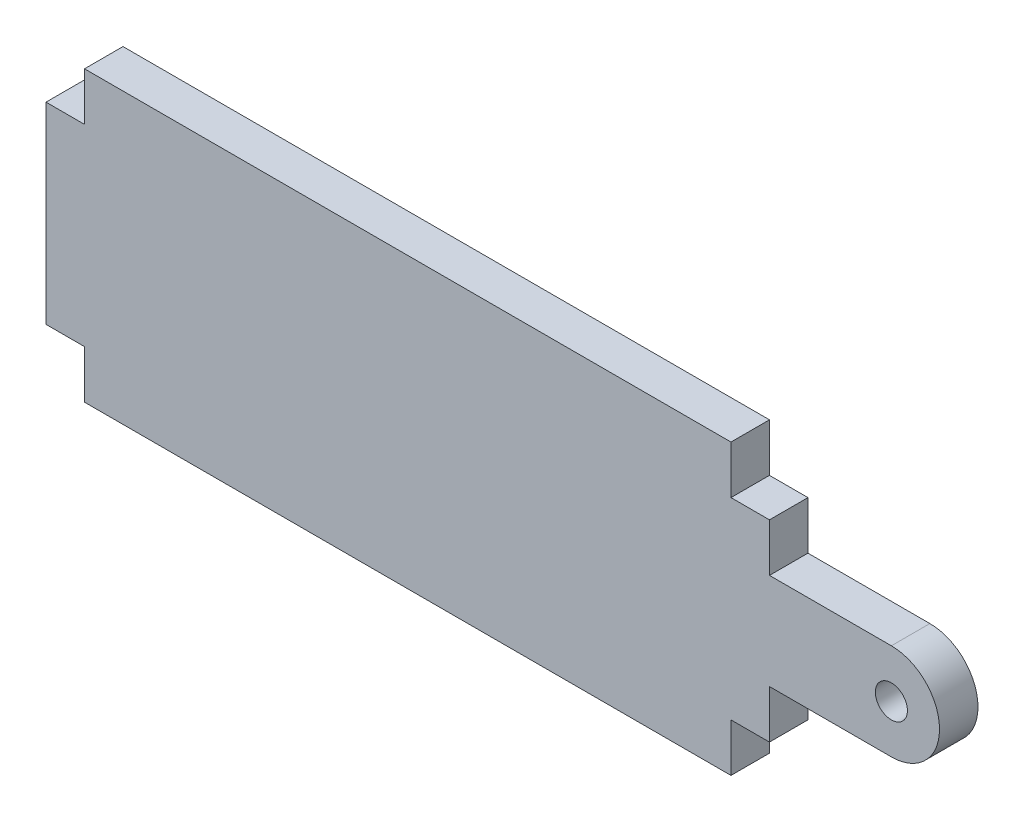
ISO-10303-21;
HEADER;
FILE_DESCRIPTION(('STEP AP214'),'2;1');
FILE_NAME('part.step','',(''),(''),'','','');
FILE_SCHEMA(('AUTOMOTIVE_DESIGN { 1 0 10303 214 1 1 1 1 }'));
ENDSEC;
DATA;
#1=APPLICATION_CONTEXT('core data for automotive mechanical design processes');
#2=APPLICATION_PROTOCOL_DEFINITION('international standard','automotive_design',2000,#1);
#3=PRODUCT_CONTEXT('',#1,'mechanical');
#4=PRODUCT('Part','Part','',(#3));
#5=PRODUCT_RELATED_PRODUCT_CATEGORY('part','',(#4));
#6=PRODUCT_DEFINITION_FORMATION('','',#4);
#7=PRODUCT_DEFINITION_CONTEXT('part definition',#1,'design');
#8=PRODUCT_DEFINITION('design','',#6,#7);
#9=PRODUCT_DEFINITION_SHAPE('','',#8);
#10=(LENGTH_UNIT() NAMED_UNIT(*) SI_UNIT(.MILLI.,.METRE.));
#11=(NAMED_UNIT(*) PLANE_ANGLE_UNIT() SI_UNIT($,.RADIAN.));
#12=(NAMED_UNIT(*) SI_UNIT($,.STERADIAN.) SOLID_ANGLE_UNIT());
#13=UNCERTAINTY_MEASURE_WITH_UNIT(LENGTH_MEASURE(1.E-05),#10,'distance_accuracy_value','');
#14=(GEOMETRIC_REPRESENTATION_CONTEXT(3) GLOBAL_UNCERTAINTY_ASSIGNED_CONTEXT((#13)) GLOBAL_UNIT_ASSIGNED_CONTEXT((#10,
#11,#12)) REPRESENTATION_CONTEXT('',''));
#15=CARTESIAN_POINT('',(0.,0.,0.));
#16=DIRECTION('',(0.,0.,1.));
#17=DIRECTION('',(1.,0.,0.));
#18=AXIS2_PLACEMENT_3D('',#15,#16,#17);
#19=CARTESIAN_POINT('',(0.,-3.00000000000007,2.4));
#20=DIRECTION('',(0.,1.,0.));
#21=DIRECTION('',(-1.,0.,0.));
#22=AXIS2_PLACEMENT_3D('',#19,#20,#21);
#23=PLANE('',#22);
#24=DIRECTION('',(1.,0.,0.));
#25=VECTOR('',#24,1.);
#26=CARTESIAN_POINT('',(0.,-3.00000000000007,0.));
#27=LINE('',#26,#25);
#28=CARTESIAN_POINT('',(22.55,-3.00000000000001,0.));
#29=VERTEX_POINT('',#28);
#30=CARTESIAN_POINT('',(30.15,-2.99999999999999,0.));
#31=VERTEX_POINT('',#30);
#32=EDGE_CURVE('E252',#29,#31,#27,.T.);
#33=ORIENTED_EDGE('',*,*,#32,.T.);
#34=DIRECTION('',(0.,0.,-1.));
#35=VECTOR('',#34,1.);
#36=CARTESIAN_POINT('',(30.15,-2.99999999999999,2.4));
#37=LINE('',#36,#35);
#38=CARTESIAN_POINT('',(30.15,-2.99999999999999,2.4));
#39=VERTEX_POINT('',#38);
#40=EDGE_CURVE('E11',#39,#31,#37,.T.);
#41=ORIENTED_EDGE('',*,*,#40,.F.);
#42=DIRECTION('',(1.,0.,0.));
#43=VECTOR('',#42,1.);
#44=CARTESIAN_POINT('',(0.,-3.00000000000007,2.4));
#45=LINE('',#44,#43);
#46=CARTESIAN_POINT('',(22.55,-3.00000000000001,2.4));
#47=VERTEX_POINT('',#46);
#48=EDGE_CURVE('E200',#47,#39,#45,.T.);
#49=ORIENTED_EDGE('',*,*,#48,.F.);
#50=DIRECTION('',(0.,0.,-1.));
#51=VECTOR('',#50,1.);
#52=CARTESIAN_POINT('',(22.55,-3.00000000000001,2.4));
#53=LINE('',#52,#51);
#54=EDGE_CURVE('E52',#47,#29,#53,.T.);
#55=ORIENTED_EDGE('',*,*,#54,.T.);
#56=EDGE_LOOP('',(#33,#41,#49,#55));
#57=FACE_BOUND('',#56,.T.);
#58=ADVANCED_FACE('F36',(#57),#23,.F.);
#59=CARTESIAN_POINT('',(30.15,0.,2.4));
#60=DIRECTION('',(0.,0.,-1.));
#61=DIRECTION('',(-1.,0.,0.));
#62=AXIS2_PLACEMENT_3D('',#59,#60,#61);
#63=CYLINDRICAL_SURFACE('',#62,2.99999999999994);
#64=CARTESIAN_POINT('',(30.15,0.,0.));
#65=DIRECTION('',(0.,0.,1.));
#66=DIRECTION('',(1.,0.,0.));
#67=AXIS2_PLACEMENT_3D('',#64,#65,#66);
#68=CIRCLE('',#67,2.99999999999994);
#69=CARTESIAN_POINT('',(30.15,2.99999999999999,0.));
#70=VERTEX_POINT('',#69);
#71=EDGE_CURVE('E249',#31,#70,#68,.T.);
#72=ORIENTED_EDGE('',*,*,#71,.T.);
#73=DIRECTION('',(0.,0.,-1.));
#74=VECTOR('',#73,1.);
#75=CARTESIAN_POINT('',(30.15,2.99999999999999,2.4));
#76=LINE('',#75,#74);
#77=CARTESIAN_POINT('',(30.15,2.99999999999999,2.4));
#78=VERTEX_POINT('',#77);
#79=EDGE_CURVE('E44',#78,#70,#76,.T.);
#80=ORIENTED_EDGE('',*,*,#79,.F.);
#81=CARTESIAN_POINT('',(30.15,0.,2.4));
#82=DIRECTION('',(0.,0.,1.));
#83=DIRECTION('',(1.,0.,0.));
#84=AXIS2_PLACEMENT_3D('',#81,#82,#83);
#85=CIRCLE('',#84,2.99999999999994);
#86=EDGE_CURVE('E115',#39,#78,#85,.T.);
#87=ORIENTED_EDGE('',*,*,#86,.F.);
#88=ORIENTED_EDGE('',*,*,#40,.T.);
#89=EDGE_LOOP('',(#72,#80,#87,#88));
#90=FACE_BOUND('',#89,.T.);
#91=ADVANCED_FACE('F250',(#90),#63,.T.);
#92=CARTESIAN_POINT('',(0.,2.99999999999999,2.4));
#93=DIRECTION('',(0.,1.,0.));
#94=DIRECTION('',(0.,0.,1.));
#95=AXIS2_PLACEMENT_3D('',#92,#93,#94);
#96=PLANE('',#95);
#97=DIRECTION('',(1.,0.,0.));
#98=VECTOR('',#97,1.);
#99=CARTESIAN_POINT('',(0.,2.99999999999999,0.));
#100=LINE('',#99,#98);
#101=CARTESIAN_POINT('',(22.55,2.99999999999999,0.));
#102=VERTEX_POINT('',#101);
#103=EDGE_CURVE('E246',#102,#70,#100,.T.);
#104=ORIENTED_EDGE('',*,*,#103,.F.);
#105=DIRECTION('',(0.,0.,-1.));
#106=VECTOR('',#105,1.);
#107=CARTESIAN_POINT('',(22.55,2.99999999999999,2.4));
#108=LINE('',#107,#106);
#109=CARTESIAN_POINT('',(22.55,2.99999999999999,2.4));
#110=VERTEX_POINT('',#109);
#111=EDGE_CURVE('E240',#110,#102,#108,.T.);
#112=ORIENTED_EDGE('',*,*,#111,.F.);
#113=DIRECTION('',(1.,0.,0.));
#114=VECTOR('',#113,1.);
#115=CARTESIAN_POINT('',(0.,2.99999999999999,2.4));
#116=LINE('',#115,#114);
#117=EDGE_CURVE('E194',#110,#78,#116,.T.);
#118=ORIENTED_EDGE('',*,*,#117,.T.);
#119=ORIENTED_EDGE('',*,*,#79,.T.);
#120=EDGE_LOOP('',(#104,#112,#118,#119));
#121=FACE_BOUND('',#120,.T.);
#122=ADVANCED_FACE('F244',(#121),#96,.T.);
#123=CARTESIAN_POINT('',(22.55,0.,2.4));
#124=DIRECTION('',(1.,0.,0.));
#125=DIRECTION('',(0.,1.,0.));
#126=AXIS2_PLACEMENT_3D('',#123,#124,#125);
#127=PLANE('',#126);
#128=DIRECTION('',(0.,-1.,0.));
#129=VECTOR('',#128,1.);
#130=CARTESIAN_POINT('',(22.55,0.,0.));
#131=LINE('',#130,#129);
#132=CARTESIAN_POINT('',(22.55,6.00000000000001,0.));
#133=VERTEX_POINT('',#132);
#134=EDGE_CURVE('E211',#133,#102,#131,.T.);
#135=ORIENTED_EDGE('',*,*,#134,.F.);
#136=DIRECTION('',(0.,0.,-1.));
#137=VECTOR('',#136,1.);
#138=CARTESIAN_POINT('',(22.55,6.00000000000001,2.4));
#139=LINE('',#138,#137);
#140=CARTESIAN_POINT('',(22.55,6.00000000000001,2.4));
#141=VERTEX_POINT('',#140);
#142=EDGE_CURVE('E238',#141,#133,#139,.T.);
#143=ORIENTED_EDGE('',*,*,#142,.F.);
#144=DIRECTION('',(0.,-1.,0.));
#145=VECTOR('',#144,1.);
#146=CARTESIAN_POINT('',(22.55,0.,2.4));
#147=LINE('',#146,#145);
#148=EDGE_CURVE('E190',#141,#110,#147,.T.);
#149=ORIENTED_EDGE('',*,*,#148,.T.);
#150=ORIENTED_EDGE('',*,*,#111,.T.);
#151=EDGE_LOOP('',(#135,#143,#149,#150));
#152=FACE_BOUND('',#151,.T.);
#153=ADVANCED_FACE('F319',(#152),#127,.T.);
#154=CARTESIAN_POINT('',(0.,6.,2.4));
#155=DIRECTION('',(0.,1.,0.));
#156=DIRECTION('',(-1.,0.,0.));
#157=AXIS2_PLACEMENT_3D('',#154,#155,#156);
#158=PLANE('',#157);
#159=DIRECTION('',(1.,0.,0.));
#160=VECTOR('',#159,1.);
#161=CARTESIAN_POINT('',(0.,6.,0.));
#162=LINE('',#161,#160);
#163=CARTESIAN_POINT('',(20.15,6.00000000000001,0.));
#164=VERTEX_POINT('',#163);
#165=EDGE_CURVE('E258',#164,#133,#162,.T.);
#166=ORIENTED_EDGE('',*,*,#165,.F.);
#167=DIRECTION('',(0.,0.,-1.));
#168=VECTOR('',#167,1.);
#169=CARTESIAN_POINT('',(20.15,6.00000000000001,2.4));
#170=LINE('',#169,#168);
#171=CARTESIAN_POINT('',(20.15,6.00000000000001,2.4));
#172=VERTEX_POINT('',#171);
#173=EDGE_CURVE('E236',#172,#164,#170,.T.);
#174=ORIENTED_EDGE('',*,*,#173,.F.);
#175=DIRECTION('',(1.,0.,0.));
#176=VECTOR('',#175,1.);
#177=CARTESIAN_POINT('',(0.,6.,2.4));
#178=LINE('',#177,#176);
#179=EDGE_CURVE('E185',#172,#141,#178,.T.);
#180=ORIENTED_EDGE('',*,*,#179,.T.);
#181=ORIENTED_EDGE('',*,*,#142,.T.);
#182=EDGE_LOOP('',(#166,#174,#180,#181));
#183=FACE_BOUND('',#182,.T.);
#184=ADVANCED_FACE('F316',(#183),#158,.T.);
#185=CARTESIAN_POINT('',(20.15,0.,2.4));
#186=DIRECTION('',(1.,0.,0.));
#187=DIRECTION('',(0.,1.,0.));
#188=AXIS2_PLACEMENT_3D('',#185,#186,#187);
#189=PLANE('',#188);
#190=DIRECTION('',(0.,-1.,0.));
#191=VECTOR('',#190,1.);
#192=CARTESIAN_POINT('',(20.15,0.,0.));
#193=LINE('',#192,#191);
#194=CARTESIAN_POINT('',(20.15,8.99999999999999,0.));
#195=VERTEX_POINT('',#194);
#196=EDGE_CURVE('E262',#195,#164,#193,.T.);
#197=ORIENTED_EDGE('',*,*,#196,.F.);
#198=DIRECTION('',(0.,0.,-1.));
#199=VECTOR('',#198,1.);
#200=CARTESIAN_POINT('',(20.15,8.99999999999999,2.4));
#201=LINE('',#200,#199);
#202=CARTESIAN_POINT('',(20.15,8.99999999999999,2.4));
#203=VERTEX_POINT('',#202);
#204=EDGE_CURVE('E234',#203,#195,#201,.T.);
#205=ORIENTED_EDGE('',*,*,#204,.F.);
#206=DIRECTION('',(0.,-1.,0.));
#207=VECTOR('',#206,1.);
#208=CARTESIAN_POINT('',(20.15,0.,2.4));
#209=LINE('',#208,#207);
#210=EDGE_CURVE('E178',#203,#172,#209,.T.);
#211=ORIENTED_EDGE('',*,*,#210,.T.);
#212=ORIENTED_EDGE('',*,*,#173,.T.);
#213=EDGE_LOOP('',(#197,#205,#211,#212));
#214=FACE_BOUND('',#213,.T.);
#215=ADVANCED_FACE('F314',(#214),#189,.T.);
#216=CARTESIAN_POINT('',(0.,8.99999999999999,2.4));
#217=DIRECTION('',(0.,-1.,0.));
#218=DIRECTION('',(0.,0.,-1.));
#219=AXIS2_PLACEMENT_3D('',#216,#217,#218);
#220=PLANE('',#219);
#221=DIRECTION('',(-1.,0.,0.));
#222=VECTOR('',#221,1.);
#223=CARTESIAN_POINT('',(0.,8.99999999999999,0.));
#224=LINE('',#223,#222);
#225=CARTESIAN_POINT('',(-20.15,8.99999999999999,0.));
#226=VERTEX_POINT('',#225);
#227=EDGE_CURVE('E265',#195,#226,#224,.T.);
#228=ORIENTED_EDGE('',*,*,#227,.T.);
#229=DIRECTION('',(0.,0.,-1.));
#230=VECTOR('',#229,1.);
#231=CARTESIAN_POINT('',(-20.15,8.99999999999999,2.4));
#232=LINE('',#231,#230);
#233=CARTESIAN_POINT('',(-20.15,8.99999999999999,2.4));
#234=VERTEX_POINT('',#233);
#235=EDGE_CURVE('E231',#234,#226,#232,.T.);
#236=ORIENTED_EDGE('',*,*,#235,.F.);
#237=DIRECTION('',(-1.,0.,0.));
#238=VECTOR('',#237,1.);
#239=CARTESIAN_POINT('',(0.,8.99999999999999,2.4));
#240=LINE('',#239,#238);
#241=EDGE_CURVE('E184',#203,#234,#240,.T.);
#242=ORIENTED_EDGE('',*,*,#241,.F.);
#243=ORIENTED_EDGE('',*,*,#204,.T.);
#244=EDGE_LOOP('',(#228,#236,#242,#243));
#245=FACE_BOUND('',#244,.T.);
#246=ADVANCED_FACE('F312',(#245),#220,.F.);
#247=CARTESIAN_POINT('',(-20.15,0.,2.4));
#248=DIRECTION('',(1.,0.,0.));
#249=DIRECTION('',(0.,1.,0.));
#250=AXIS2_PLACEMENT_3D('',#247,#248,#249);
#251=PLANE('',#250);
#252=DIRECTION('',(0.,-1.,0.));
#253=VECTOR('',#252,1.);
#254=CARTESIAN_POINT('',(-20.15,0.,0.));
#255=LINE('',#254,#253);
#256=CARTESIAN_POINT('',(-20.15,6.,0.));
#257=VERTEX_POINT('',#256);
#258=EDGE_CURVE('E267',#226,#257,#255,.T.);
#259=ORIENTED_EDGE('',*,*,#258,.T.);
#260=DIRECTION('',(0.,0.,-1.));
#261=VECTOR('',#260,1.);
#262=CARTESIAN_POINT('',(-20.15,6.,2.4));
#263=LINE('',#262,#261);
#264=CARTESIAN_POINT('',(-20.15,6.,2.4));
#265=VERTEX_POINT('',#264);
#266=EDGE_CURVE('E228',#265,#257,#263,.T.);
#267=ORIENTED_EDGE('',*,*,#266,.F.);
#268=DIRECTION('',(0.,-1.,0.));
#269=VECTOR('',#268,1.);
#270=CARTESIAN_POINT('',(-20.15,0.,2.4));
#271=LINE('',#270,#269);
#272=EDGE_CURVE('E188',#234,#265,#271,.T.);
#273=ORIENTED_EDGE('',*,*,#272,.F.);
#274=ORIENTED_EDGE('',*,*,#235,.T.);
#275=EDGE_LOOP('',(#259,#267,#273,#274));
#276=FACE_BOUND('',#275,.T.);
#277=ADVANCED_FACE('F308',(#276),#251,.F.);
#278=CARTESIAN_POINT('',(0.,6.,2.4));
#279=DIRECTION('',(0.,-1.,0.));
#280=DIRECTION('',(0.,0.,-1.));
#281=AXIS2_PLACEMENT_3D('',#278,#279,#280);
#282=PLANE('',#281);
#283=DIRECTION('',(-1.,0.,0.));
#284=VECTOR('',#283,1.);
#285=CARTESIAN_POINT('',(0.,6.,0.));
#286=LINE('',#285,#284);
#287=CARTESIAN_POINT('',(-22.55,6.,0.));
#288=VERTEX_POINT('',#287);
#289=EDGE_CURVE('E269',#257,#288,#286,.T.);
#290=ORIENTED_EDGE('',*,*,#289,.T.);
#291=DIRECTION('',(0.,0.,-1.));
#292=VECTOR('',#291,1.);
#293=CARTESIAN_POINT('',(-22.55,6.,2.4));
#294=LINE('',#293,#292);
#295=CARTESIAN_POINT('',(-22.55,6.,2.4));
#296=VERTEX_POINT('',#295);
#297=EDGE_CURVE('E225',#296,#288,#294,.T.);
#298=ORIENTED_EDGE('',*,*,#297,.F.);
#299=DIRECTION('',(-1.,0.,0.));
#300=VECTOR('',#299,1.);
#301=CARTESIAN_POINT('',(0.,6.,2.4));
#302=LINE('',#301,#300);
#303=EDGE_CURVE('E305',#265,#296,#302,.T.);
#304=ORIENTED_EDGE('',*,*,#303,.F.);
#305=ORIENTED_EDGE('',*,*,#266,.T.);
#306=EDGE_LOOP('',(#290,#298,#304,#305));
#307=FACE_BOUND('',#306,.T.);
#308=ADVANCED_FACE('F302',(#307),#282,.F.);
#309=CARTESIAN_POINT('',(-22.55,0.,2.4));
#310=DIRECTION('',(1.,0.,0.));
#311=DIRECTION('',(0.,0.,-1.));
#312=AXIS2_PLACEMENT_3D('',#309,#310,#311);
#313=PLANE('',#312);
#314=DIRECTION('',(0.,-1.,0.));
#315=VECTOR('',#314,1.);
#316=CARTESIAN_POINT('',(-22.55,0.,0.));
#317=LINE('',#316,#315);
#318=CARTESIAN_POINT('',(-22.55,-6.,0.));
#319=VERTEX_POINT('',#318);
#320=EDGE_CURVE('E272',#288,#319,#317,.T.);
#321=ORIENTED_EDGE('',*,*,#320,.T.);
#322=DIRECTION('',(0.,0.,-1.));
#323=VECTOR('',#322,1.);
#324=CARTESIAN_POINT('',(-22.55,-6.,2.4));
#325=LINE('',#324,#323);
#326=CARTESIAN_POINT('',(-22.55,-6.,2.4));
#327=VERTEX_POINT('',#326);
#328=EDGE_CURVE('E223',#327,#319,#325,.T.);
#329=ORIENTED_EDGE('',*,*,#328,.F.);
#330=DIRECTION('',(0.,-1.,0.));
#331=VECTOR('',#330,1.);
#332=CARTESIAN_POINT('',(-22.55,0.,2.4));
#333=LINE('',#332,#331);
#334=EDGE_CURVE('E321',#296,#327,#333,.T.);
#335=ORIENTED_EDGE('',*,*,#334,.F.);
#336=ORIENTED_EDGE('',*,*,#297,.T.);
#337=EDGE_LOOP('',(#321,#329,#335,#336));
#338=FACE_BOUND('',#337,.T.);
#339=ADVANCED_FACE('F296',(#338),#313,.F.);
#340=CARTESIAN_POINT('',(0.,-6.,2.4));
#341=DIRECTION('',(0.,-1.,0.));
#342=DIRECTION('',(0.,0.,-1.));
#343=AXIS2_PLACEMENT_3D('',#340,#341,#342);
#344=PLANE('',#343);
#345=DIRECTION('',(-1.,0.,0.));
#346=VECTOR('',#345,1.);
#347=CARTESIAN_POINT('',(0.,-6.,0.));
#348=LINE('',#347,#346);
#349=CARTESIAN_POINT('',(-20.15,-6.,0.));
#350=VERTEX_POINT('',#349);
#351=EDGE_CURVE('E275',#350,#319,#348,.T.);
#352=ORIENTED_EDGE('',*,*,#351,.F.);
#353=DIRECTION('',(0.,0.,-1.));
#354=VECTOR('',#353,1.);
#355=CARTESIAN_POINT('',(-20.15,-6.,2.4));
#356=LINE('',#355,#354);
#357=CARTESIAN_POINT('',(-20.15,-6.,2.4));
#358=VERTEX_POINT('',#357);
#359=EDGE_CURVE('E221',#358,#350,#356,.T.);
#360=ORIENTED_EDGE('',*,*,#359,.F.);
#361=DIRECTION('',(-1.,0.,0.));
#362=VECTOR('',#361,1.);
#363=CARTESIAN_POINT('',(0.,-6.,2.4));
#364=LINE('',#363,#362);
#365=EDGE_CURVE('E293',#358,#327,#364,.T.);
#366=ORIENTED_EDGE('',*,*,#365,.T.);
#367=ORIENTED_EDGE('',*,*,#328,.T.);
#368=EDGE_LOOP('',(#352,#360,#366,#367));
#369=FACE_BOUND('',#368,.T.);
#370=ADVANCED_FACE('F289',(#369),#344,.T.);
#371=CARTESIAN_POINT('',(-20.15,-8.99999999999999,0.));
#372=VERTEX_POINT('',#371);
#373=EDGE_CURVE('E270',#350,#372,#255,.T.);
#374=ORIENTED_EDGE('',*,*,#373,.T.);
#375=DIRECTION('',(0.,0.,-1.));
#376=VECTOR('',#375,1.);
#377=CARTESIAN_POINT('',(-20.15,-8.99999999999999,2.4));
#378=LINE('',#377,#376);
#379=CARTESIAN_POINT('',(-20.15,-8.99999999999999,2.4));
#380=VERTEX_POINT('',#379);
#381=EDGE_CURVE('E219',#380,#372,#378,.T.);
#382=ORIENTED_EDGE('',*,*,#381,.F.);
#383=EDGE_CURVE('E179',#358,#380,#271,.T.);
#384=ORIENTED_EDGE('',*,*,#383,.F.);
#385=ORIENTED_EDGE('',*,*,#359,.T.);
#386=EDGE_LOOP('',(#374,#382,#384,#385));
#387=FACE_BOUND('',#386,.T.);
#388=ADVANCED_FACE('F284',(#387),#251,.F.);
#389=CARTESIAN_POINT('',(0.,-8.99999999999998,2.4));
#390=DIRECTION('',(0.,-1.,0.));
#391=DIRECTION('',(1.,0.,0.));
#392=AXIS2_PLACEMENT_3D('',#389,#390,#391);
#393=PLANE('',#392);
#394=DIRECTION('',(-1.,0.,0.));
#395=VECTOR('',#394,1.);
#396=CARTESIAN_POINT('',(0.,-8.99999999999998,0.));
#397=LINE('',#396,#395);
#398=CARTESIAN_POINT('',(20.15,-8.99999999999997,0.));
#399=VERTEX_POINT('',#398);
#400=EDGE_CURVE('E277',#399,#372,#397,.T.);
#401=ORIENTED_EDGE('',*,*,#400,.F.);
#402=DIRECTION('',(0.,0.,-1.));
#403=VECTOR('',#402,1.);
#404=CARTESIAN_POINT('',(20.15,-8.99999999999997,2.4));
#405=LINE('',#404,#403);
#406=CARTESIAN_POINT('',(20.15,-8.99999999999997,2.4));
#407=VERTEX_POINT('',#406);
#408=EDGE_CURVE('E164',#407,#399,#405,.T.);
#409=ORIENTED_EDGE('',*,*,#408,.F.);
#410=DIRECTION('',(-1.,0.,0.));
#411=VECTOR('',#410,1.);
#412=CARTESIAN_POINT('',(0.,-8.99999999999998,2.4));
#413=LINE('',#412,#411);
#414=EDGE_CURVE('E176',#407,#380,#413,.T.);
#415=ORIENTED_EDGE('',*,*,#414,.T.);
#416=ORIENTED_EDGE('',*,*,#381,.T.);
#417=EDGE_LOOP('',(#401,#409,#415,#416));
#418=FACE_BOUND('',#417,.T.);
#419=ADVANCED_FACE('F360',(#418),#393,.T.);
#420=CARTESIAN_POINT('',(20.15,-5.99999999999998,0.));
#421=VERTEX_POINT('',#420);
#422=EDGE_CURVE('E161',#421,#399,#193,.T.);
#423=ORIENTED_EDGE('',*,*,#422,.F.);
#424=DIRECTION('',(0.,0.,-1.));
#425=VECTOR('',#424,1.);
#426=CARTESIAN_POINT('',(20.15,-5.99999999999998,2.4));
#427=LINE('',#426,#425);
#428=CARTESIAN_POINT('',(20.15,-5.99999999999998,2.4));
#429=VERTEX_POINT('',#428);
#430=EDGE_CURVE('E155',#429,#421,#427,.T.);
#431=ORIENTED_EDGE('',*,*,#430,.F.);
#432=EDGE_CURVE('E159',#429,#407,#209,.T.);
#433=ORIENTED_EDGE('',*,*,#432,.T.);
#434=ORIENTED_EDGE('',*,*,#408,.T.);
#435=EDGE_LOOP('',(#423,#431,#433,#434));
#436=FACE_BOUND('',#435,.T.);
#437=ADVANCED_FACE('F157',(#436),#189,.T.);
#438=CARTESIAN_POINT('',(0.,-5.99999999999998,2.4));
#439=DIRECTION('',(0.,1.,0.));
#440=DIRECTION('',(0.,0.,1.));
#441=AXIS2_PLACEMENT_3D('',#438,#439,#440);
#442=PLANE('',#441);
#443=DIRECTION('',(1.,0.,0.));
#444=VECTOR('',#443,1.);
#445=CARTESIAN_POINT('',(0.,-5.99999999999998,0.));
#446=LINE('',#445,#444);
#447=CARTESIAN_POINT('',(22.55,-5.99999999999998,0.));
#448=VERTEX_POINT('',#447);
#449=EDGE_CURVE('E209',#421,#448,#446,.T.);
#450=ORIENTED_EDGE('',*,*,#449,.T.);
#451=DIRECTION('',(0.,0.,-1.));
#452=VECTOR('',#451,1.);
#453=CARTESIAN_POINT('',(22.55,-5.99999999999998,2.4));
#454=LINE('',#453,#452);
#455=CARTESIAN_POINT('',(22.55,-5.99999999999998,2.4));
#456=VERTEX_POINT('',#455);
#457=EDGE_CURVE('E103',#456,#448,#454,.T.);
#458=ORIENTED_EDGE('',*,*,#457,.F.);
#459=DIRECTION('',(1.,0.,0.));
#460=VECTOR('',#459,1.);
#461=CARTESIAN_POINT('',(0.,-5.99999999999998,2.4));
#462=LINE('',#461,#460);
#463=EDGE_CURVE('E166',#429,#456,#462,.T.);
#464=ORIENTED_EDGE('',*,*,#463,.F.);
#465=ORIENTED_EDGE('',*,*,#430,.T.);
#466=EDGE_LOOP('',(#450,#458,#464,#465));
#467=FACE_BOUND('',#466,.T.);
#468=ADVANCED_FACE('F167',(#467),#442,.F.);
#469=EDGE_CURVE('E204',#29,#448,#131,.T.);
#470=ORIENTED_EDGE('',*,*,#469,.F.);
#471=ORIENTED_EDGE('',*,*,#54,.F.);
#472=EDGE_CURVE('E170',#47,#456,#147,.T.);
#473=ORIENTED_EDGE('',*,*,#472,.T.);
#474=ORIENTED_EDGE('',*,*,#457,.T.);
#475=EDGE_LOOP('',(#470,#471,#473,#474));
#476=FACE_BOUND('',#475,.T.);
#477=ADVANCED_FACE('F327',(#476),#127,.T.);
#478=CARTESIAN_POINT('',(30.15,0.,2.4));
#479=DIRECTION('',(0.,0.,-1.));
#480=DIRECTION('',(-1.,0.,0.));
#481=AXIS2_PLACEMENT_3D('',#478,#479,#480);
#482=CYLINDRICAL_SURFACE('',#481,1.);
#483=CARTESIAN_POINT('',(30.15,0.,2.4));
#484=DIRECTION('',(0.,0.,1.));
#485=DIRECTION('',(1.,0.,0.));
#486=AXIS2_PLACEMENT_3D('',#483,#484,#485);
#487=CIRCLE('',#486,1.);
#488=CARTESIAN_POINT('',(31.15,0.,2.4));
#489=VERTEX_POINT('',#488);
#490=EDGE_CURVE('E216',#489,#489,#487,.T.);
#491=ORIENTED_EDGE('',*,*,#490,.T.);
#492=EDGE_LOOP('',(#491));
#493=FACE_BOUND('',#492,.T.);
#494=CARTESIAN_POINT('',(30.15,0.,0.));
#495=DIRECTION('',(0.,0.,1.));
#496=DIRECTION('',(1.,0.,0.));
#497=AXIS2_PLACEMENT_3D('',#494,#495,#496);
#498=CIRCLE('',#497,1.);
#499=CARTESIAN_POINT('',(31.15,0.,0.));
#500=VERTEX_POINT('',#499);
#501=EDGE_CURVE('E201',#500,#500,#498,.T.);
#502=ORIENTED_EDGE('',*,*,#501,.F.);
#503=EDGE_LOOP('',(#502));
#504=FACE_BOUND('',#503,.T.);
#505=ADVANCED_FACE('F329',(#493,#504),#482,.F.);
#506=CARTESIAN_POINT('',(0.,0.,2.4));
#507=DIRECTION('',(0.,0.,1.));
#508=DIRECTION('',(1.,0.,0.));
#509=AXIS2_PLACEMENT_3D('',#506,#507,#508);
#510=PLANE('',#509);
#511=ORIENTED_EDGE('',*,*,#48,.T.);
#512=ORIENTED_EDGE('',*,*,#86,.T.);
#513=ORIENTED_EDGE('',*,*,#117,.F.);
#514=ORIENTED_EDGE('',*,*,#148,.F.);
#515=ORIENTED_EDGE('',*,*,#179,.F.);
#516=ORIENTED_EDGE('',*,*,#210,.F.);
#517=ORIENTED_EDGE('',*,*,#241,.T.);
#518=ORIENTED_EDGE('',*,*,#272,.T.);
#519=ORIENTED_EDGE('',*,*,#303,.T.);
#520=ORIENTED_EDGE('',*,*,#334,.T.);
#521=ORIENTED_EDGE('',*,*,#365,.F.);
#522=ORIENTED_EDGE('',*,*,#383,.T.);
#523=ORIENTED_EDGE('',*,*,#414,.F.);
#524=ORIENTED_EDGE('',*,*,#432,.F.);
#525=ORIENTED_EDGE('',*,*,#463,.T.);
#526=ORIENTED_EDGE('',*,*,#472,.F.);
#527=EDGE_LOOP('',(#511,#512,#513,#514,#515,#516,#517,#518,#519,#520,#521,#522,#523,#524,#525,#526));
#528=FACE_BOUND('',#527,.T.);
#529=ORIENTED_EDGE('',*,*,#490,.F.);
#530=EDGE_LOOP('',(#529));
#531=FACE_BOUND('',#530,.T.);
#532=ADVANCED_FACE('F173',(#528,#531),#510,.T.);
#533=CARTESIAN_POINT('',(0.,0.,0.));
#534=DIRECTION('',(0.,0.,1.));
#535=DIRECTION('',(1.,0.,0.));
#536=AXIS2_PLACEMENT_3D('',#533,#534,#535);
#537=PLANE('',#536);
#538=ORIENTED_EDGE('',*,*,#32,.F.);
#539=ORIENTED_EDGE('',*,*,#469,.T.);
#540=ORIENTED_EDGE('',*,*,#449,.F.);
#541=ORIENTED_EDGE('',*,*,#422,.T.);
#542=ORIENTED_EDGE('',*,*,#400,.T.);
#543=ORIENTED_EDGE('',*,*,#373,.F.);
#544=ORIENTED_EDGE('',*,*,#351,.T.);
#545=ORIENTED_EDGE('',*,*,#320,.F.);
#546=ORIENTED_EDGE('',*,*,#289,.F.);
#547=ORIENTED_EDGE('',*,*,#258,.F.);
#548=ORIENTED_EDGE('',*,*,#227,.F.);
#549=ORIENTED_EDGE('',*,*,#196,.T.);
#550=ORIENTED_EDGE('',*,*,#165,.T.);
#551=ORIENTED_EDGE('',*,*,#134,.T.);
#552=ORIENTED_EDGE('',*,*,#103,.T.);
#553=ORIENTED_EDGE('',*,*,#71,.F.);
#554=EDGE_LOOP('',(#538,#539,#540,#541,#542,#543,#544,#545,#546,#547,#548,#549,#550,#551,#552,#553));
#555=FACE_BOUND('',#554,.T.);
#556=ORIENTED_EDGE('',*,*,#501,.T.);
#557=EDGE_LOOP('',(#556));
#558=FACE_BOUND('',#557,.T.);
#559=ADVANCED_FACE('F254',(#555,#558),#537,.F.);
#560=CLOSED_SHELL('',(#58,#91,#122,#153,#184,#215,#246,#277,#308,#339,#370,#388,#419,#437,#468,
#477,#505,#532,#559));
#561=MANIFOLD_SOLID_BREP('B2',#560);
#562=ADVANCED_BREP_SHAPE_REPRESENTATION('',(#18,#561),#14);
#563=SHAPE_DEFINITION_REPRESENTATION(#9,#562);
ENDSEC;
END-ISO-10303-21;
